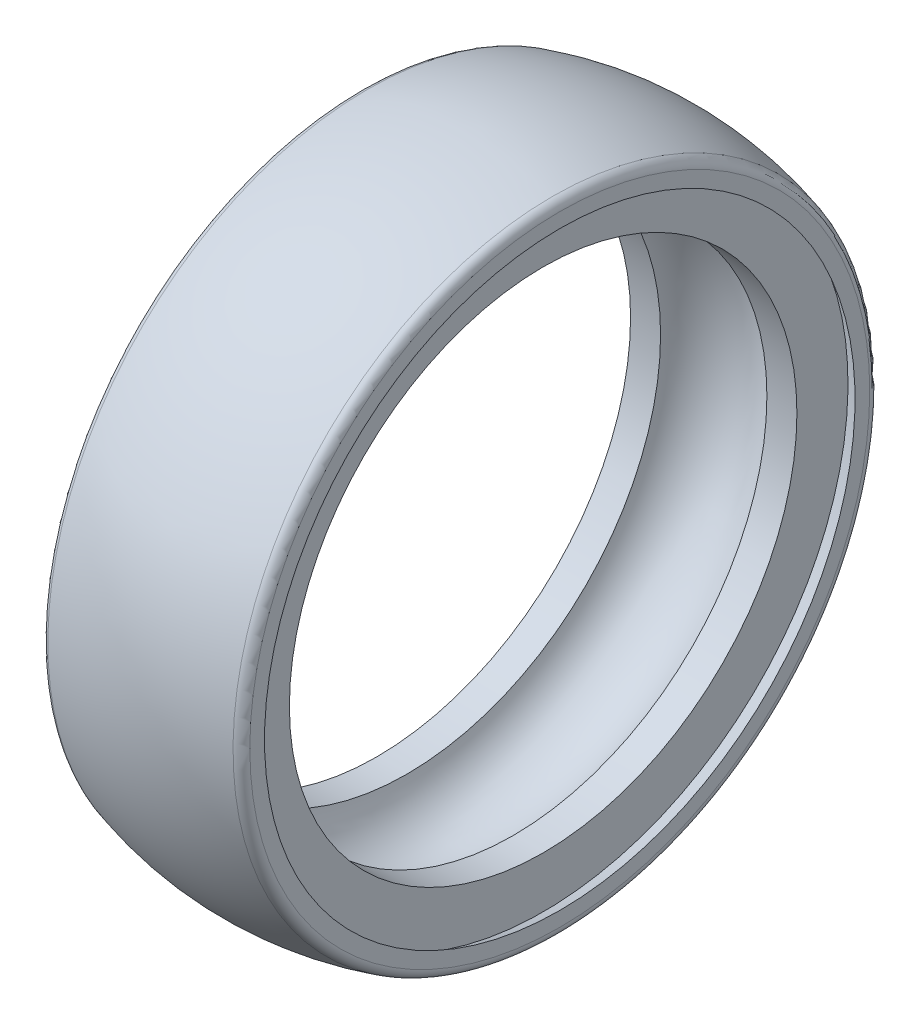
ISO-10303-21;
HEADER;
FILE_DESCRIPTION(('STEP AP214'),'2;1');
FILE_NAME('part.step','',(''),(''),'','','');
FILE_SCHEMA(('AUTOMOTIVE_DESIGN { 1 0 10303 214 1 1 1 1 }'));
ENDSEC;
DATA;
#1=APPLICATION_CONTEXT('core data for automotive mechanical design processes');
#2=APPLICATION_PROTOCOL_DEFINITION('international standard','automotive_design',2000,#1);
#3=PRODUCT_CONTEXT('',#1,'mechanical');
#4=PRODUCT('Part','Part','',(#3));
#5=PRODUCT_RELATED_PRODUCT_CATEGORY('part','',(#4));
#6=PRODUCT_DEFINITION_FORMATION('','',#4);
#7=PRODUCT_DEFINITION_CONTEXT('part definition',#1,'design');
#8=PRODUCT_DEFINITION('design','',#6,#7);
#9=PRODUCT_DEFINITION_SHAPE('','',#8);
#10=(LENGTH_UNIT() NAMED_UNIT(*) SI_UNIT(.MILLI.,.METRE.));
#11=(NAMED_UNIT(*) PLANE_ANGLE_UNIT() SI_UNIT($,.RADIAN.));
#12=(NAMED_UNIT(*) SI_UNIT($,.STERADIAN.) SOLID_ANGLE_UNIT());
#13=UNCERTAINTY_MEASURE_WITH_UNIT(LENGTH_MEASURE(1.E-05),#10,'distance_accuracy_value','');
#14=(GEOMETRIC_REPRESENTATION_CONTEXT(3) GLOBAL_UNCERTAINTY_ASSIGNED_CONTEXT((#13)) GLOBAL_UNIT_ASSIGNED_CONTEXT((#10,
#11,#12)) REPRESENTATION_CONTEXT('',''));
#15=CARTESIAN_POINT('',(0.,0.,0.));
#16=DIRECTION('',(0.,0.,1.));
#17=DIRECTION('',(1.,0.,0.));
#18=AXIS2_PLACEMENT_3D('',#15,#16,#17);
#19=CARTESIAN_POINT('',(7.25,4.19779378364869,0.));
#20=DIRECTION('',(1.,0.,0.));
#21=DIRECTION('',(0.,1.,0.));
#22=AXIS2_PLACEMENT_3D('',#19,#20,#21);
#23=PLANE('',#22);
#24=CARTESIAN_POINT('',(7.25,0.,0.));
#25=DIRECTION('',(1.,0.,0.));
#26=DIRECTION('',(0.,1.,0.));
#27=AXIS2_PLACEMENT_3D('',#24,#25,#26);
#28=CIRCLE('',#27,4.58183756729741);
#29=CARTESIAN_POINT('',(7.25,4.5818375672974,0.));
#30=VERTEX_POINT('',#29);
#31=EDGE_CURVE('E11',#30,#30,#28,.T.);
#32=ORIENTED_EDGE('',*,*,#31,.T.);
#33=EDGE_LOOP('',(#32));
#34=FACE_BOUND('',#33,.T.);
#35=CARTESIAN_POINT('',(7.25,0.,0.));
#36=DIRECTION('',(1.,0.,0.));
#37=DIRECTION('',(0.,1.,0.));
#38=AXIS2_PLACEMENT_3D('',#35,#36,#37);
#39=CIRCLE('',#38,3.81375);
#40=CARTESIAN_POINT('',(7.25,3.81374999999999,0.));
#41=VERTEX_POINT('',#40);
#42=EDGE_CURVE('E89',#41,#41,#39,.T.);
#43=ORIENTED_EDGE('',*,*,#42,.F.);
#44=EDGE_LOOP('',(#43));
#45=FACE_BOUND('',#44,.T.);
#46=ADVANCED_FACE('F34',(#34,#45),#23,.T.);
#47=CARTESIAN_POINT('',(7.375,0.,0.));
#48=DIRECTION('',(-1.,0.,0.));
#49=DIRECTION('',(0.,1.,0.));
#50=AXIS2_PLACEMENT_3D('',#47,#48,#49);
#51=CONICAL_SURFACE('',#50,4.5096687836487,0.523598775598299);
#52=CARTESIAN_POINT('',(7.5,0.,0.));
#53=DIRECTION('',(1.,0.,0.));
#54=DIRECTION('',(0.,1.,0.));
#55=AXIS2_PLACEMENT_3D('',#52,#53,#54);
#56=CIRCLE('',#55,4.4375);
#57=CARTESIAN_POINT('',(7.5,4.43749999999999,0.));
#58=VERTEX_POINT('',#57);
#59=EDGE_CURVE('E42',#58,#58,#56,.T.);
#60=ORIENTED_EDGE('',*,*,#59,.T.);
#61=EDGE_LOOP('',(#60));
#62=FACE_BOUND('',#61,.T.);
#63=ORIENTED_EDGE('',*,*,#31,.F.);
#64=EDGE_LOOP('',(#63));
#65=FACE_BOUND('',#64,.T.);
#66=ADVANCED_FACE('F123',(#62,#65),#51,.F.);
#67=CARTESIAN_POINT('',(7.5,4.54791293977042,0.));
#68=DIRECTION('',(1.,0.,0.));
#69=DIRECTION('',(0.,1.,0.));
#70=AXIS2_PLACEMENT_3D('',#67,#68,#69);
#71=PLANE('',#70);
#72=CARTESIAN_POINT('',(7.5,0.,0.));
#73=DIRECTION('',(1.,0.,0.));
#74=DIRECTION('',(0.,1.,0.));
#75=AXIS2_PLACEMENT_3D('',#72,#73,#74);
#76=CIRCLE('',#75,4.65832587954085);
#77=CARTESIAN_POINT('',(7.5,4.65832587954084,0.));
#78=VERTEX_POINT('',#77);
#79=EDGE_CURVE('E92',#78,#78,#76,.T.);
#80=ORIENTED_EDGE('',*,*,#79,.T.);
#81=EDGE_LOOP('',(#80));
#82=FACE_BOUND('',#81,.T.);
#83=ORIENTED_EDGE('',*,*,#59,.F.);
#84=EDGE_LOOP('',(#83));
#85=FACE_BOUND('',#84,.T.);
#86=ADVANCED_FACE('F128',(#82,#85),#71,.T.);
#87=CARTESIAN_POINT('',(7.35,0.,0.));
#88=DIRECTION('',(1.,0.,0.));
#89=DIRECTION('',(0.,0.,-1.));
#90=AXIS2_PLACEMENT_3D('',#87,#88,#89);
#91=TOROIDAL_SURFACE('',#90,4.65832587954085,0.15);
#92=CARTESIAN_POINT('',(7.39175257731958,0.,0.));
#93=DIRECTION('',(1.,0.,0.));
#94=DIRECTION('',(0.,1.,0.));
#95=AXIS2_PLACEMENT_3D('',#92,#93,#94);
#96=CIRCLE('',#95,4.80239781395964);
#97=CARTESIAN_POINT('',(7.39175257731958,4.80239781395963,0.));
#98=VERTEX_POINT('',#97);
#99=EDGE_CURVE('E94',#98,#98,#96,.T.);
#100=ORIENTED_EDGE('',*,*,#99,.T.);
#101=EDGE_LOOP('',(#100));
#102=FACE_BOUND('',#101,.T.);
#103=ORIENTED_EDGE('',*,*,#79,.F.);
#104=EDGE_LOOP('',(#103));
#105=FACE_BOUND('',#104,.T.);
#106=ADVANCED_FACE('F139',(#102,#105),#91,.T.);
#107=CARTESIAN_POINT('',(6.,0.,0.));
#108=DIRECTION('',(0.,0.,1.));
#109=DIRECTION('',(1.,0.,0.));
#110=AXIS2_PLACEMENT_3D('',#107,#108,#109);
#111=SPHERICAL_SURFACE('',#110,5.);
#112=CARTESIAN_POINT('',(6.,0.,0.));
#113=DIRECTION('',(1.,0.,0.));
#114=DIRECTION('',(0.,1.,0.));
#115=AXIS2_PLACEMENT_3D('',#112,#113,#114);
#116=SPHERICAL_SURFACE('',#115,5.);
#117=CARTESIAN_POINT('',(4.60824742268041,0.,0.));
#118=DIRECTION('',(1.,0.,0.));
#119=DIRECTION('',(0.,1.,0.));
#120=AXIS2_PLACEMENT_3D('',#117,#118,#119);
#121=CIRCLE('',#120,4.80239781395964);
#122=CARTESIAN_POINT('',(4.60824742268041,4.80239781395963,0.));
#123=VERTEX_POINT('',#122);
#124=EDGE_CURVE('E95',#123,#123,#121,.T.);
#125=ORIENTED_EDGE('',*,*,#124,.T.);
#126=EDGE_LOOP('',(#125));
#127=FACE_BOUND('',#126,.T.);
#128=ORIENTED_EDGE('',*,*,#99,.F.);
#129=EDGE_LOOP('',(#128));
#130=FACE_BOUND('',#129,.T.);
#131=ADVANCED_FACE('F143',(#127,#130),#116,.T.);
#132=CARTESIAN_POINT('',(4.65,0.,0.));
#133=DIRECTION('',(1.,0.,0.));
#134=DIRECTION('',(0.,0.,-1.));
#135=AXIS2_PLACEMENT_3D('',#132,#133,#134);
#136=TOROIDAL_SURFACE('',#135,4.65832587954085,0.15);
#137=CARTESIAN_POINT('',(4.5,0.,0.));
#138=DIRECTION('',(1.,0.,0.));
#139=DIRECTION('',(0.,1.,0.));
#140=AXIS2_PLACEMENT_3D('',#137,#138,#139);
#141=CIRCLE('',#140,4.65832587954085);
#142=CARTESIAN_POINT('',(4.5,4.65832587954084,0.));
#143=VERTEX_POINT('',#142);
#144=EDGE_CURVE('E98',#143,#143,#141,.T.);
#145=ORIENTED_EDGE('',*,*,#144,.T.);
#146=EDGE_LOOP('',(#145));
#147=FACE_BOUND('',#146,.T.);
#148=ORIENTED_EDGE('',*,*,#124,.F.);
#149=EDGE_LOOP('',(#148));
#150=FACE_BOUND('',#149,.T.);
#151=ADVANCED_FACE('F36',(#147,#150),#136,.T.);
#152=CARTESIAN_POINT('',(4.5,4.54791293977042,0.));
#153=DIRECTION('',(-1.,0.,0.));
#154=DIRECTION('',(0.,-1.,0.));
#155=AXIS2_PLACEMENT_3D('',#152,#153,#154);
#156=PLANE('',#155);
#157=CARTESIAN_POINT('',(4.5,0.,0.));
#158=DIRECTION('',(1.,0.,0.));
#159=DIRECTION('',(0.,1.,0.));
#160=AXIS2_PLACEMENT_3D('',#157,#158,#159);
#161=CIRCLE('',#160,4.4375);
#162=CARTESIAN_POINT('',(4.5,4.43749999999999,0.));
#163=VERTEX_POINT('',#162);
#164=EDGE_CURVE('E87',#163,#163,#161,.T.);
#165=ORIENTED_EDGE('',*,*,#164,.T.);
#166=EDGE_LOOP('',(#165));
#167=FACE_BOUND('',#166,.T.);
#168=ORIENTED_EDGE('',*,*,#144,.F.);
#169=EDGE_LOOP('',(#168));
#170=FACE_BOUND('',#169,.T.);
#171=ADVANCED_FACE('F109',(#167,#170),#156,.T.);
#172=CARTESIAN_POINT('',(4.625,0.,0.));
#173=DIRECTION('',(1.,0.,0.));
#174=DIRECTION('',(0.,1.,0.));
#175=AXIS2_PLACEMENT_3D('',#172,#173,#174);
#176=CONICAL_SURFACE('',#175,4.5096687836487,0.523598775598299);
#177=CARTESIAN_POINT('',(4.75,0.,0.));
#178=DIRECTION('',(1.,0.,0.));
#179=DIRECTION('',(0.,1.,0.));
#180=AXIS2_PLACEMENT_3D('',#177,#178,#179);
#181=CIRCLE('',#180,4.58183756729741);
#182=CARTESIAN_POINT('',(4.75,4.5818375672974,0.));
#183=VERTEX_POINT('',#182);
#184=EDGE_CURVE('E84',#183,#183,#181,.T.);
#185=ORIENTED_EDGE('',*,*,#184,.T.);
#186=EDGE_LOOP('',(#185));
#187=FACE_BOUND('',#186,.T.);
#188=ORIENTED_EDGE('',*,*,#164,.F.);
#189=EDGE_LOOP('',(#188));
#190=FACE_BOUND('',#189,.T.);
#191=ADVANCED_FACE('F112',(#187,#190),#176,.F.);
#192=CARTESIAN_POINT('',(4.75,4.19779378364869,0.));
#193=DIRECTION('',(-1.,0.,0.));
#194=DIRECTION('',(0.,-1.,0.));
#195=AXIS2_PLACEMENT_3D('',#192,#193,#194);
#196=PLANE('',#195);
#197=CARTESIAN_POINT('',(4.75,0.,0.));
#198=DIRECTION('',(1.,0.,0.));
#199=DIRECTION('',(0.,1.,0.));
#200=AXIS2_PLACEMENT_3D('',#197,#198,#199);
#201=CIRCLE('',#200,3.81375);
#202=CARTESIAN_POINT('',(4.75,3.81374999999999,0.));
#203=VERTEX_POINT('',#202);
#204=EDGE_CURVE('E80',#203,#203,#201,.T.);
#205=ORIENTED_EDGE('',*,*,#204,.T.);
#206=EDGE_LOOP('',(#205));
#207=FACE_BOUND('',#206,.T.);
#208=ORIENTED_EDGE('',*,*,#184,.F.);
#209=EDGE_LOOP('',(#208));
#210=FACE_BOUND('',#209,.T.);
#211=ADVANCED_FACE('F81',(#207,#210),#196,.T.);
#212=CARTESIAN_POINT('',(4.97553795940665,0.,0.));
#213=DIRECTION('',(-1.,0.,0.));
#214=DIRECTION('',(0.,1.,0.));
#215=AXIS2_PLACEMENT_3D('',#212,#213,#214);
#216=CYLINDRICAL_SURFACE('',#215,3.81375);
#217=CARTESIAN_POINT('',(5.2010759188133,0.,0.));
#218=DIRECTION('',(1.,0.,0.));
#219=DIRECTION('',(0.,1.,0.));
#220=AXIS2_PLACEMENT_3D('',#217,#218,#219);
#221=CIRCLE('',#220,3.81375);
#222=CARTESIAN_POINT('',(5.2010759188133,3.81374999999999,0.));
#223=VERTEX_POINT('',#222);
#224=EDGE_CURVE('E85',#223,#223,#221,.T.);
#225=ORIENTED_EDGE('',*,*,#224,.T.);
#226=EDGE_LOOP('',(#225));
#227=FACE_BOUND('',#226,.T.);
#228=ORIENTED_EDGE('',*,*,#204,.F.);
#229=EDGE_LOOP('',(#228));
#230=FACE_BOUND('',#229,.T.);
#231=ADVANCED_FACE('F119',(#227,#230),#216,.F.);
#232=CARTESIAN_POINT('',(6.,0.,0.));
#233=DIRECTION('',(1.,0.,0.));
#234=DIRECTION('',(0.,0.,-1.));
#235=AXIS2_PLACEMENT_3D('',#232,#233,#234);
#236=TOROIDAL_SURFACE('',#235,3.5625,0.8375);
#237=CARTESIAN_POINT('',(6.79892408118669,0.,0.));
#238=DIRECTION('',(1.,0.,0.));
#239=DIRECTION('',(0.,1.,0.));
#240=AXIS2_PLACEMENT_3D('',#237,#238,#239);
#241=CIRCLE('',#240,3.81375);
#242=CARTESIAN_POINT('',(6.79892408118669,3.81374999999999,0.));
#243=VERTEX_POINT('',#242);
#244=EDGE_CURVE('E105',#243,#243,#241,.T.);
#245=ORIENTED_EDGE('',*,*,#244,.T.);
#246=EDGE_LOOP('',(#245));
#247=FACE_BOUND('',#246,.T.);
#248=ORIENTED_EDGE('',*,*,#224,.F.);
#249=EDGE_LOOP('',(#248));
#250=FACE_BOUND('',#249,.T.);
#251=ADVANCED_FACE('F132',(#247,#250),#236,.F.);
#252=CARTESIAN_POINT('',(7.02446204059335,0.,0.));
#253=DIRECTION('',(-1.,0.,0.));
#254=DIRECTION('',(0.,1.,0.));
#255=AXIS2_PLACEMENT_3D('',#252,#253,#254);
#256=CYLINDRICAL_SURFACE('',#255,3.81375);
#257=ORIENTED_EDGE('',*,*,#42,.T.);
#258=EDGE_LOOP('',(#257));
#259=FACE_BOUND('',#258,.T.);
#260=ORIENTED_EDGE('',*,*,#244,.F.);
#261=EDGE_LOOP('',(#260));
#262=FACE_BOUND('',#261,.T.);
#263=ADVANCED_FACE('F135',(#259,#262),#256,.F.);
#264=CLOSED_SHELL('',(#46,#66,#86,#106,#131,#151,#171,#191,#211,#231,#251,#263));
#265=MANIFOLD_SOLID_BREP('B2',#264);
#266=ADVANCED_BREP_SHAPE_REPRESENTATION('',(#18,#265),#14);
#267=SHAPE_DEFINITION_REPRESENTATION(#9,#266);
ENDSEC;
END-ISO-10303-21;
